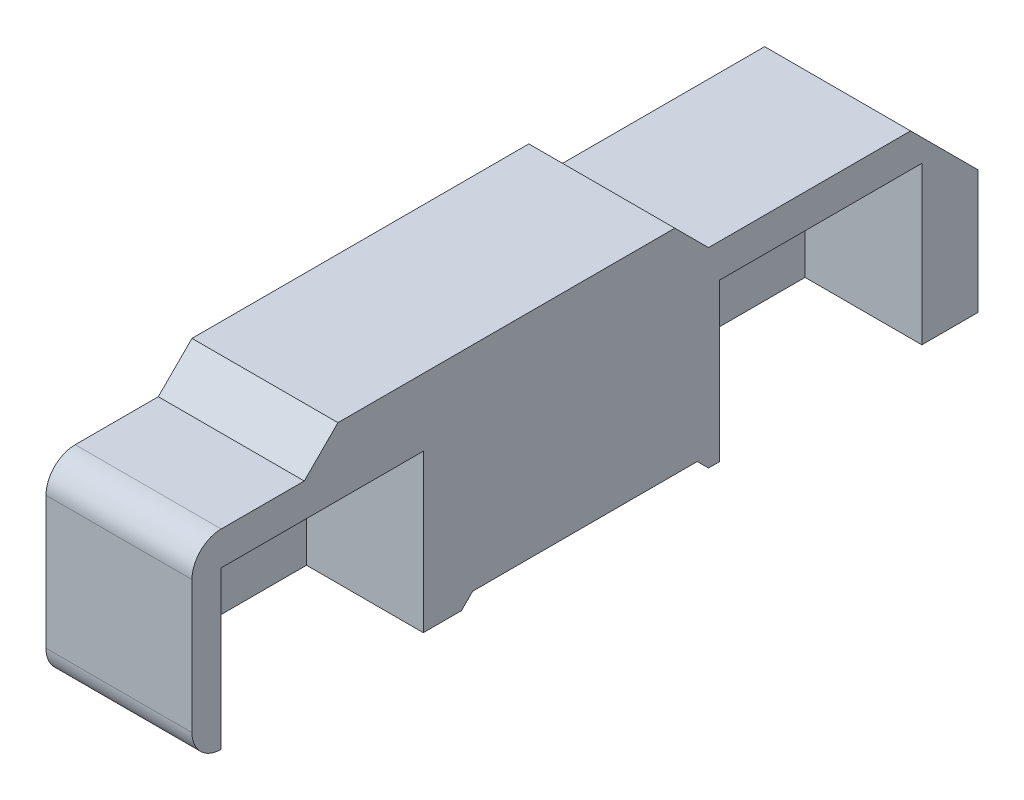
ISO-10303-21;
HEADER;
FILE_DESCRIPTION(('STEP AP214'),'2;1');
FILE_NAME('part.step','',(''),(''),'','','');
FILE_SCHEMA(('AUTOMOTIVE_DESIGN { 1 0 10303 214 1 1 1 1 }'));
ENDSEC;
DATA;
#1=APPLICATION_CONTEXT('core data for automotive mechanical design processes');
#2=APPLICATION_PROTOCOL_DEFINITION('international standard','automotive_design',2000,#1);
#3=PRODUCT_CONTEXT('',#1,'mechanical');
#4=PRODUCT('Part','Part','',(#3));
#5=PRODUCT_RELATED_PRODUCT_CATEGORY('part','',(#4));
#6=PRODUCT_DEFINITION_FORMATION('','',#4);
#7=PRODUCT_DEFINITION_CONTEXT('part definition',#1,'design');
#8=PRODUCT_DEFINITION('design','',#6,#7);
#9=PRODUCT_DEFINITION_SHAPE('','',#8);
#10=(LENGTH_UNIT() NAMED_UNIT(*) SI_UNIT(.MILLI.,.METRE.));
#11=(NAMED_UNIT(*) PLANE_ANGLE_UNIT() SI_UNIT($,.RADIAN.));
#12=(NAMED_UNIT(*) SI_UNIT($,.STERADIAN.) SOLID_ANGLE_UNIT());
#13=UNCERTAINTY_MEASURE_WITH_UNIT(LENGTH_MEASURE(1.E-05),#10,'distance_accuracy_value','');
#14=(GEOMETRIC_REPRESENTATION_CONTEXT(3) GLOBAL_UNCERTAINTY_ASSIGNED_CONTEXT((#13)) GLOBAL_UNIT_ASSIGNED_CONTEXT((#10,
#11,#12)) REPRESENTATION_CONTEXT('',''));
#15=CARTESIAN_POINT('',(0.,0.,0.));
#16=DIRECTION('',(0.,0.,1.));
#17=DIRECTION('',(1.,0.,0.));
#18=AXIS2_PLACEMENT_3D('',#15,#16,#17);
#19=CARTESIAN_POINT('',(65.,0.,0.));
#20=DIRECTION('',(0.,1.,0.));
#21=DIRECTION('',(0.,0.,1.));
#22=AXIS2_PLACEMENT_3D('',#19,#20,#21);
#23=PLANE('',#22);
#24=DIRECTION('',(0.,0.,-1.));
#25=VECTOR('',#24,1.);
#26=CARTESIAN_POINT('',(65.,0.,0.));
#27=LINE('',#26,#25);
#28=CARTESIAN_POINT('',(65.,0.,-103.));
#29=VERTEX_POINT('',#28);
#30=CARTESIAN_POINT('',(65.,0.,-120.));
#31=VERTEX_POINT('',#30);
#32=EDGE_CURVE('E271',#29,#31,#27,.T.);
#33=ORIENTED_EDGE('',*,*,#32,.F.);
#34=DIRECTION('',(1.,0.,0.));
#35=VECTOR('',#34,1.);
#36=CARTESIAN_POINT('',(13.,0.,-103.));
#37=LINE('',#36,#35);
#38=CARTESIAN_POINT('',(13.,0.,-103.));
#39=VERTEX_POINT('',#38);
#40=EDGE_CURVE('E227',#39,#29,#37,.T.);
#41=ORIENTED_EDGE('',*,*,#40,.F.);
#42=DIRECTION('',(0.,0.,-1.));
#43=VECTOR('',#42,1.);
#44=CARTESIAN_POINT('',(13.,0.,-13.));
#45=LINE('',#44,#43);
#46=CARTESIAN_POINT('',(13.,0.,-13.));
#47=VERTEX_POINT('',#46);
#48=EDGE_CURVE('E217',#47,#39,#45,.T.);
#49=ORIENTED_EDGE('',*,*,#48,.F.);
#50=DIRECTION('',(-1.,0.,0.));
#51=VECTOR('',#50,1.);
#52=CARTESIAN_POINT('',(65.,0.,-13.));
#53=LINE('',#52,#51);
#54=CARTESIAN_POINT('',(0.,0.,-13.));
#55=VERTEX_POINT('',#54);
#56=EDGE_CURVE('E210',#47,#55,#53,.T.);
#57=ORIENTED_EDGE('',*,*,#56,.T.);
#58=DIRECTION('',(0.,0.,-1.));
#59=VECTOR('',#58,1.);
#60=CARTESIAN_POINT('',(0.,0.,0.));
#61=LINE('',#60,#59);
#62=CARTESIAN_POINT('',(0.,0.,-120.));
#63=VERTEX_POINT('',#62);
#64=EDGE_CURVE('E341',#55,#63,#61,.T.);
#65=ORIENTED_EDGE('',*,*,#64,.T.);
#66=DIRECTION('',(-1.,0.,0.));
#67=VECTOR('',#66,1.);
#68=CARTESIAN_POINT('',(65.,0.,-120.));
#69=LINE('',#68,#67);
#70=EDGE_CURVE('E236',#31,#63,#69,.T.);
#71=ORIENTED_EDGE('',*,*,#70,.F.);
#72=EDGE_LOOP('',(#33,#41,#49,#57,#65,#71));
#73=FACE_BOUND('',#72,.T.);
#74=ADVANCED_FACE('F43',(#73),#23,.F.);
#75=CARTESIAN_POINT('',(65.,0.,-120.));
#76=DIRECTION('',(0.,0.707106781186546,0.707106781186549));
#77=DIRECTION('',(0.,-0.707106781186549,0.707106781186546));
#78=AXIS2_PLACEMENT_3D('',#75,#76,#77);
#79=PLANE('',#78);
#80=DIRECTION('',(0.,0.707106781186549,-0.707106781186546));
#81=VECTOR('',#80,1.);
#82=CARTESIAN_POINT('',(0.,0.,-120.));
#83=LINE('',#82,#81);
#84=CARTESIAN_POINT('',(0.,5.,-125.));
#85=VERTEX_POINT('',#84);
#86=EDGE_CURVE('E332',#63,#85,#83,.T.);
#87=ORIENTED_EDGE('',*,*,#86,.T.);
#88=DIRECTION('',(-1.,0.,0.));
#89=VECTOR('',#88,1.);
#90=CARTESIAN_POINT('',(65.,5.,-125.));
#91=LINE('',#90,#89);
#92=CARTESIAN_POINT('',(65.,5.,-125.));
#93=VERTEX_POINT('',#92);
#94=EDGE_CURVE('E239',#93,#85,#91,.T.);
#95=ORIENTED_EDGE('',*,*,#94,.F.);
#96=DIRECTION('',(0.,0.707106781186549,-0.707106781186546));
#97=VECTOR('',#96,1.);
#98=CARTESIAN_POINT('',(65.,0.,-120.));
#99=LINE('',#98,#97);
#100=EDGE_CURVE('E276',#31,#93,#99,.T.);
#101=ORIENTED_EDGE('',*,*,#100,.F.);
#102=ORIENTED_EDGE('',*,*,#70,.T.);
#103=EDGE_LOOP('',(#87,#95,#101,#102));
#104=FACE_BOUND('',#103,.T.);
#105=ADVANCED_FACE('F494',(#104),#79,.F.);
#106=CARTESIAN_POINT('',(65.,5.,-125.));
#107=DIRECTION('',(0.,1.,0.));
#108=DIRECTION('',(0.,0.,1.));
#109=AXIS2_PLACEMENT_3D('',#106,#107,#108);
#110=PLANE('',#109);
#111=DIRECTION('',(0.,0.,-1.));
#112=VECTOR('',#111,1.);
#113=CARTESIAN_POINT('',(0.,5.,-125.));
#114=LINE('',#113,#112);
#115=CARTESIAN_POINT('',(0.,5.,-225.));
#116=VERTEX_POINT('',#115);
#117=EDGE_CURVE('E325',#85,#116,#114,.T.);
#118=ORIENTED_EDGE('',*,*,#117,.T.);
#119=DIRECTION('',(-1.,0.,0.));
#120=VECTOR('',#119,1.);
#121=CARTESIAN_POINT('',(65.,5.,-225.));
#122=LINE('',#121,#120);
#123=CARTESIAN_POINT('',(65.,5.,-225.));
#124=VERTEX_POINT('',#123);
#125=EDGE_CURVE('E314',#124,#116,#122,.T.);
#126=ORIENTED_EDGE('',*,*,#125,.F.);
#127=DIRECTION('',(0.,0.,-1.));
#128=VECTOR('',#127,1.);
#129=CARTESIAN_POINT('',(65.,5.,-125.));
#130=LINE('',#129,#128);
#131=EDGE_CURVE('E326',#93,#124,#130,.T.);
#132=ORIENTED_EDGE('',*,*,#131,.F.);
#133=ORIENTED_EDGE('',*,*,#94,.T.);
#134=EDGE_LOOP('',(#118,#126,#132,#133));
#135=FACE_BOUND('',#134,.T.);
#136=ADVANCED_FACE('F323',(#135),#110,.F.);
#137=CARTESIAN_POINT('',(65.,5.,-225.));
#138=DIRECTION('',(0.,0.70710678118655,-0.707106781186545));
#139=DIRECTION('',(0.,0.707106781186545,0.70710678118655));
#140=AXIS2_PLACEMENT_3D('',#137,#138,#139);
#141=PLANE('',#140);
#142=DIRECTION('',(0.,-0.707106781186545,-0.70710678118655));
#143=VECTOR('',#142,1.);
#144=CARTESIAN_POINT('',(0.,5.,-225.));
#145=LINE('',#144,#143);
#146=CARTESIAN_POINT('',(0.,0.,-230.));
#147=VERTEX_POINT('',#146);
#148=EDGE_CURVE('E334',#116,#147,#145,.T.);
#149=ORIENTED_EDGE('',*,*,#148,.T.);
#150=DIRECTION('',(-1.,0.,0.));
#151=VECTOR('',#150,1.);
#152=CARTESIAN_POINT('',(65.,0.,-230.));
#153=LINE('',#152,#151);
#154=CARTESIAN_POINT('',(65.,0.,-230.));
#155=VERTEX_POINT('',#154);
#156=EDGE_CURVE('E310',#155,#147,#153,.T.);
#157=ORIENTED_EDGE('',*,*,#156,.F.);
#158=DIRECTION('',(0.,-0.707106781186545,-0.70710678118655));
#159=VECTOR('',#158,1.);
#160=CARTESIAN_POINT('',(65.,5.,-225.));
#161=LINE('',#160,#159);
#162=EDGE_CURVE('E439',#124,#155,#161,.T.);
#163=ORIENTED_EDGE('',*,*,#162,.F.);
#164=ORIENTED_EDGE('',*,*,#125,.T.);
#165=EDGE_LOOP('',(#149,#157,#163,#164));
#166=FACE_BOUND('',#165,.T.);
#167=ADVANCED_FACE('F491',(#166),#141,.F.);
#168=CARTESIAN_POINT('',(65.,0.,-230.));
#169=DIRECTION('',(0.,1.,0.));
#170=DIRECTION('',(0.,0.,1.));
#171=AXIS2_PLACEMENT_3D('',#168,#169,#170);
#172=PLANE('',#171);
#173=DIRECTION('',(0.,0.,-1.));
#174=VECTOR('',#173,1.);
#175=CARTESIAN_POINT('',(13.,0.,-235.));
#176=LINE('',#175,#174);
#177=CARTESIAN_POINT('',(13.,0.,-235.));
#178=VERTEX_POINT('',#177);
#179=CARTESIAN_POINT('',(13.,0.,-325.));
#180=VERTEX_POINT('',#179);
#181=EDGE_CURVE('E428',#178,#180,#176,.T.);
#182=ORIENTED_EDGE('',*,*,#181,.F.);
#183=DIRECTION('',(1.,0.,0.));
#184=VECTOR('',#183,1.);
#185=CARTESIAN_POINT('',(13.,0.,-235.));
#186=LINE('',#185,#184);
#187=CARTESIAN_POINT('',(65.,0.,-235.));
#188=VERTEX_POINT('',#187);
#189=EDGE_CURVE('E397',#178,#188,#186,.T.);
#190=ORIENTED_EDGE('',*,*,#189,.T.);
#191=DIRECTION('',(0.,0.,-1.));
#192=VECTOR('',#191,1.);
#193=CARTESIAN_POINT('',(65.,0.,-230.));
#194=LINE('',#193,#192);
#195=EDGE_CURVE('E443',#155,#188,#194,.T.);
#196=ORIENTED_EDGE('',*,*,#195,.F.);
#197=ORIENTED_EDGE('',*,*,#156,.T.);
#198=DIRECTION('',(0.,0.,-1.));
#199=VECTOR('',#198,1.);
#200=CARTESIAN_POINT('',(0.,0.,-230.));
#201=LINE('',#200,#199);
#202=CARTESIAN_POINT('',(0.,0.,-350.));
#203=VERTEX_POINT('',#202);
#204=EDGE_CURVE('E339',#147,#203,#201,.T.);
#205=ORIENTED_EDGE('',*,*,#204,.T.);
#206=DIRECTION('',(-1.,0.,0.));
#207=VECTOR('',#206,1.);
#208=CARTESIAN_POINT('',(65.,0.,-350.));
#209=LINE('',#208,#207);
#210=CARTESIAN_POINT('',(65.,0.,-350.));
#211=VERTEX_POINT('',#210);
#212=EDGE_CURVE('E306',#211,#203,#209,.T.);
#213=ORIENTED_EDGE('',*,*,#212,.F.);
#214=CARTESIAN_POINT('',(65.,0.,-325.));
#215=VERTEX_POINT('',#214);
#216=EDGE_CURVE('E442',#215,#211,#194,.T.);
#217=ORIENTED_EDGE('',*,*,#216,.F.);
#218=DIRECTION('',(1.,0.,0.));
#219=VECTOR('',#218,1.);
#220=CARTESIAN_POINT('',(13.,0.,-325.));
#221=LINE('',#220,#219);
#222=EDGE_CURVE('E59',#180,#215,#221,.T.);
#223=ORIENTED_EDGE('',*,*,#222,.F.);
#224=EDGE_LOOP('',(#182,#190,#196,#197,#205,#213,#217,#223));
#225=FACE_BOUND('',#224,.T.);
#226=ADVANCED_FACE('F486',(#225),#172,.F.);
#227=CARTESIAN_POINT('',(65.,55.0000000000002,-350.));
#228=DIRECTION('',(0.,0.,1.));
#229=DIRECTION('',(1.,0.,0.));
#230=AXIS2_PLACEMENT_3D('',#227,#228,#229);
#231=PLANE('',#230);
#232=DIRECTION('',(0.,1.,0.));
#233=VECTOR('',#232,1.);
#234=CARTESIAN_POINT('',(0.,55.0000000000002,-350.));
#235=LINE('',#234,#233);
#236=CARTESIAN_POINT('',(0.,55.0000000000002,-350.));
#237=VERTEX_POINT('',#236);
#238=EDGE_CURVE('E347',#203,#237,#235,.T.);
#239=ORIENTED_EDGE('',*,*,#238,.T.);
#240=DIRECTION('',(-1.,0.,0.));
#241=VECTOR('',#240,1.);
#242=CARTESIAN_POINT('',(65.,55.0000000000002,-350.));
#243=LINE('',#242,#241);
#244=CARTESIAN_POINT('',(65.,55.0000000000002,-350.));
#245=VERTEX_POINT('',#244);
#246=EDGE_CURVE('E302',#245,#237,#243,.T.);
#247=ORIENTED_EDGE('',*,*,#246,.F.);
#248=DIRECTION('',(0.,1.,0.));
#249=VECTOR('',#248,1.);
#250=CARTESIAN_POINT('',(65.,55.0000000000002,-350.));
#251=LINE('',#250,#249);
#252=EDGE_CURVE('E447',#211,#245,#251,.T.);
#253=ORIENTED_EDGE('',*,*,#252,.F.);
#254=ORIENTED_EDGE('',*,*,#212,.T.);
#255=EDGE_LOOP('',(#239,#247,#253,#254));
#256=FACE_BOUND('',#255,.T.);
#257=ADVANCED_FACE('F480',(#256),#231,.F.);
#258=CARTESIAN_POINT('',(65.,85.,-320.));
#259=DIRECTION('',(0.,-0.707106781186548,0.707106781186547));
#260=DIRECTION('',(0.,-0.707106781186547,-0.707106781186548));
#261=AXIS2_PLACEMENT_3D('',#258,#259,#260);
#262=PLANE('',#261);
#263=DIRECTION('',(0.,0.707106781186547,0.707106781186548));
#264=VECTOR('',#263,1.);
#265=CARTESIAN_POINT('',(0.,85.,-320.));
#266=LINE('',#265,#264);
#267=CARTESIAN_POINT('',(0.,85.,-320.));
#268=VERTEX_POINT('',#267);
#269=EDGE_CURVE('E350',#237,#268,#266,.T.);
#270=ORIENTED_EDGE('',*,*,#269,.T.);
#271=DIRECTION('',(-1.,0.,0.));
#272=VECTOR('',#271,1.);
#273=CARTESIAN_POINT('',(65.,85.,-320.));
#274=LINE('',#273,#272);
#275=CARTESIAN_POINT('',(65.,85.,-320.));
#276=VERTEX_POINT('',#275);
#277=EDGE_CURVE('E298',#276,#268,#274,.T.);
#278=ORIENTED_EDGE('',*,*,#277,.F.);
#279=DIRECTION('',(0.,0.707106781186547,0.707106781186548));
#280=VECTOR('',#279,1.);
#281=CARTESIAN_POINT('',(65.,85.,-320.));
#282=LINE('',#281,#280);
#283=EDGE_CURVE('E450',#245,#276,#282,.T.);
#284=ORIENTED_EDGE('',*,*,#283,.F.);
#285=ORIENTED_EDGE('',*,*,#246,.T.);
#286=EDGE_LOOP('',(#270,#278,#284,#285));
#287=FACE_BOUND('',#286,.T.);
#288=ADVANCED_FACE('F476',(#287),#262,.F.);
#289=CARTESIAN_POINT('',(65.,85.,-230.));
#290=DIRECTION('',(0.,-1.,0.));
#291=DIRECTION('',(0.,0.,-1.));
#292=AXIS2_PLACEMENT_3D('',#289,#290,#291);
#293=PLANE('',#292);
#294=DIRECTION('',(0.,0.,1.));
#295=VECTOR('',#294,1.);
#296=CARTESIAN_POINT('',(0.,85.,-230.));
#297=LINE('',#296,#295);
#298=CARTESIAN_POINT('',(0.,85.,-230.));
#299=VERTEX_POINT('',#298);
#300=EDGE_CURVE('E353',#268,#299,#297,.T.);
#301=ORIENTED_EDGE('',*,*,#300,.T.);
#302=DIRECTION('',(-1.,0.,0.));
#303=VECTOR('',#302,1.);
#304=CARTESIAN_POINT('',(65.,85.,-230.));
#305=LINE('',#304,#303);
#306=CARTESIAN_POINT('',(65.,85.,-230.));
#307=VERTEX_POINT('',#306);
#308=EDGE_CURVE('E294',#307,#299,#305,.T.);
#309=ORIENTED_EDGE('',*,*,#308,.F.);
#310=DIRECTION('',(0.,0.,1.));
#311=VECTOR('',#310,1.);
#312=CARTESIAN_POINT('',(65.,85.,-230.));
#313=LINE('',#312,#311);
#314=EDGE_CURVE('E453',#276,#307,#313,.T.);
#315=ORIENTED_EDGE('',*,*,#314,.F.);
#316=ORIENTED_EDGE('',*,*,#277,.T.);
#317=EDGE_LOOP('',(#301,#309,#315,#316));
#318=FACE_BOUND('',#317,.T.);
#319=ADVANCED_FACE('F472',(#318),#293,.F.);
#320=CARTESIAN_POINT('',(65.,100.,-215.));
#321=DIRECTION('',(0.,-0.70710678118655,0.707106781186545));
#322=DIRECTION('',(0.,-0.707106781186545,-0.70710678118655));
#323=AXIS2_PLACEMENT_3D('',#320,#321,#322);
#324=PLANE('',#323);
#325=DIRECTION('',(0.,0.707106781186546,0.70710678118655));
#326=VECTOR('',#325,1.);
#327=CARTESIAN_POINT('',(0.,100.,-215.));
#328=LINE('',#327,#326);
#329=CARTESIAN_POINT('',(0.,100.,-215.));
#330=VERTEX_POINT('',#329);
#331=EDGE_CURVE('E356',#299,#330,#328,.T.);
#332=ORIENTED_EDGE('',*,*,#331,.T.);
#333=DIRECTION('',(-1.,0.,0.));
#334=VECTOR('',#333,1.);
#335=CARTESIAN_POINT('',(65.,100.,-215.));
#336=LINE('',#335,#334);
#337=CARTESIAN_POINT('',(65.,100.,-215.));
#338=VERTEX_POINT('',#337);
#339=EDGE_CURVE('E290',#338,#330,#336,.T.);
#340=ORIENTED_EDGE('',*,*,#339,.F.);
#341=DIRECTION('',(0.,0.707106781186546,0.70710678118655));
#342=VECTOR('',#341,1.);
#343=CARTESIAN_POINT('',(65.,100.,-215.));
#344=LINE('',#343,#342);
#345=EDGE_CURVE('E456',#307,#338,#344,.T.);
#346=ORIENTED_EDGE('',*,*,#345,.F.);
#347=ORIENTED_EDGE('',*,*,#308,.T.);
#348=EDGE_LOOP('',(#332,#340,#346,#347));
#349=FACE_BOUND('',#348,.T.);
#350=ADVANCED_FACE('F468',(#349),#324,.F.);
#351=CARTESIAN_POINT('',(65.,100.,-64.9999999999999));
#352=DIRECTION('',(0.,-1.,0.));
#353=DIRECTION('',(0.,0.,-1.));
#354=AXIS2_PLACEMENT_3D('',#351,#352,#353);
#355=PLANE('',#354);
#356=DIRECTION('',(0.,0.,1.));
#357=VECTOR('',#356,1.);
#358=CARTESIAN_POINT('',(0.,100.,-64.9999999999999));
#359=LINE('',#358,#357);
#360=CARTESIAN_POINT('',(0.,100.,-64.9999999999999));
#361=VERTEX_POINT('',#360);
#362=EDGE_CURVE('E359',#330,#361,#359,.T.);
#363=ORIENTED_EDGE('',*,*,#362,.T.);
#364=DIRECTION('',(-1.,0.,0.));
#365=VECTOR('',#364,1.);
#366=CARTESIAN_POINT('',(65.,100.,-64.9999999999999));
#367=LINE('',#366,#365);
#368=CARTESIAN_POINT('',(65.,100.,-64.9999999999999));
#369=VERTEX_POINT('',#368);
#370=EDGE_CURVE('E286',#369,#361,#367,.T.);
#371=ORIENTED_EDGE('',*,*,#370,.F.);
#372=DIRECTION('',(0.,0.,1.));
#373=VECTOR('',#372,1.);
#374=CARTESIAN_POINT('',(65.,100.,-64.9999999999999));
#375=LINE('',#374,#373);
#376=EDGE_CURVE('E380',#338,#369,#375,.T.);
#377=ORIENTED_EDGE('',*,*,#376,.F.);
#378=ORIENTED_EDGE('',*,*,#339,.T.);
#379=EDGE_LOOP('',(#363,#371,#377,#378));
#380=FACE_BOUND('',#379,.T.);
#381=ADVANCED_FACE('F463',(#380),#355,.F.);
#382=CARTESIAN_POINT('',(65.,85.,-50.));
#383=DIRECTION('',(0.,-0.707106781186546,-0.707106781186549));
#384=DIRECTION('',(0.,0.707106781186549,-0.707106781186546));
#385=AXIS2_PLACEMENT_3D('',#382,#383,#384);
#386=PLANE('',#385);
#387=DIRECTION('',(0.,-0.707106781186549,0.707106781186546));
#388=VECTOR('',#387,1.);
#389=CARTESIAN_POINT('',(0.,85.,-50.));
#390=LINE('',#389,#388);
#391=CARTESIAN_POINT('',(0.,85.,-50.));
#392=VERTEX_POINT('',#391);
#393=EDGE_CURVE('E278',#361,#392,#390,.T.);
#394=ORIENTED_EDGE('',*,*,#393,.T.);
#395=DIRECTION('',(-1.,0.,0.));
#396=VECTOR('',#395,1.);
#397=CARTESIAN_POINT('',(65.,85.,-50.));
#398=LINE('',#397,#396);
#399=CARTESIAN_POINT('',(65.,85.,-50.));
#400=VERTEX_POINT('',#399);
#401=EDGE_CURVE('E282',#400,#392,#398,.T.);
#402=ORIENTED_EDGE('',*,*,#401,.F.);
#403=DIRECTION('',(0.,-0.707106781186549,0.707106781186546));
#404=VECTOR('',#403,1.);
#405=CARTESIAN_POINT('',(65.,85.,-50.));
#406=LINE('',#405,#404);
#407=EDGE_CURVE('E374',#369,#400,#406,.T.);
#408=ORIENTED_EDGE('',*,*,#407,.F.);
#409=ORIENTED_EDGE('',*,*,#370,.T.);
#410=EDGE_LOOP('',(#394,#402,#408,#409));
#411=FACE_BOUND('',#410,.T.);
#412=ADVANCED_FACE('F365',(#411),#386,.F.);
#413=CARTESIAN_POINT('',(65.,85.,0.));
#414=DIRECTION('',(0.,-1.,0.));
#415=DIRECTION('',(0.,0.,-1.));
#416=AXIS2_PLACEMENT_3D('',#413,#414,#415);
#417=PLANE('',#416);
#418=DIRECTION('',(0.,0.,1.));
#419=VECTOR('',#418,1.);
#420=CARTESIAN_POINT('',(0.,85.,0.));
#421=LINE('',#420,#419);
#422=CARTESIAN_POINT('',(0.,85.,-13.));
#423=VERTEX_POINT('',#422);
#424=EDGE_CURVE('E272',#392,#423,#421,.T.);
#425=ORIENTED_EDGE('',*,*,#424,.T.);
#426=DIRECTION('',(-1.,0.,0.));
#427=VECTOR('',#426,1.);
#428=CARTESIAN_POINT('',(65.,85.,-13.));
#429=LINE('',#428,#427);
#430=CARTESIAN_POINT('',(65.,85.,-13.));
#431=VERTEX_POINT('',#430);
#432=EDGE_CURVE('E11',#423,#431,#429,.F.);
#433=ORIENTED_EDGE('',*,*,#432,.T.);
#434=DIRECTION('',(0.,0.,1.));
#435=VECTOR('',#434,1.);
#436=CARTESIAN_POINT('',(65.,85.,0.));
#437=LINE('',#436,#435);
#438=EDGE_CURVE('E371',#400,#431,#437,.T.);
#439=ORIENTED_EDGE('',*,*,#438,.F.);
#440=ORIENTED_EDGE('',*,*,#401,.T.);
#441=EDGE_LOOP('',(#425,#433,#439,#440));
#442=FACE_BOUND('',#441,.T.);
#443=ADVANCED_FACE('F370',(#442),#417,.F.);
#444=CARTESIAN_POINT('',(65.,0.,0.));
#445=DIRECTION('',(0.,0.,-1.));
#446=DIRECTION('',(-1.,0.,0.));
#447=AXIS2_PLACEMENT_3D('',#444,#445,#446);
#448=PLANE('',#447);
#449=DIRECTION('',(0.,-1.,0.));
#450=VECTOR('',#449,1.);
#451=CARTESIAN_POINT('',(0.,0.,0.));
#452=LINE('',#451,#450);
#453=CARTESIAN_POINT('',(0.,72.,0.));
#454=VERTEX_POINT('',#453);
#455=CARTESIAN_POINT('',(0.,13.,0.));
#456=VERTEX_POINT('',#455);
#457=EDGE_CURVE('E268',#454,#456,#452,.T.);
#458=ORIENTED_EDGE('',*,*,#457,.T.);
#459=DIRECTION('',(-1.,0.,0.));
#460=VECTOR('',#459,1.);
#461=CARTESIAN_POINT('',(65.,13.,0.));
#462=LINE('',#461,#460);
#463=CARTESIAN_POINT('',(65.,13.,0.));
#464=VERTEX_POINT('',#463);
#465=EDGE_CURVE('E251',#456,#464,#462,.F.);
#466=ORIENTED_EDGE('',*,*,#465,.T.);
#467=DIRECTION('',(0.,-1.,0.));
#468=VECTOR('',#467,1.);
#469=CARTESIAN_POINT('',(65.,0.,0.));
#470=LINE('',#469,#468);
#471=CARTESIAN_POINT('',(65.,72.,0.));
#472=VERTEX_POINT('',#471);
#473=EDGE_CURVE('E262',#472,#464,#470,.T.);
#474=ORIENTED_EDGE('',*,*,#473,.F.);
#475=DIRECTION('',(-1.,0.,0.));
#476=VECTOR('',#475,1.);
#477=CARTESIAN_POINT('',(65.,72.,0.));
#478=LINE('',#477,#476);
#479=EDGE_CURVE('E247',#472,#454,#478,.T.);
#480=ORIENTED_EDGE('',*,*,#479,.T.);
#481=EDGE_LOOP('',(#458,#466,#474,#480));
#482=FACE_BOUND('',#481,.T.);
#483=ADVANCED_FACE('F265',(#482),#448,.F.);
#484=CARTESIAN_POINT('',(65.,0.,0.));
#485=DIRECTION('',(-1.,0.,0.));
#486=DIRECTION('',(0.,0.,1.));
#487=AXIS2_PLACEMENT_3D('',#484,#485,#486);
#488=PLANE('',#487);
#489=CARTESIAN_POINT('',(65.,13.,-13.));
#490=DIRECTION('',(-1.,0.,0.));
#491=DIRECTION('',(0.,0.,1.));
#492=AXIS2_PLACEMENT_3D('',#489,#490,#491);
#493=CIRCLE('',#492,13.);
#494=CARTESIAN_POINT('',(65.,0.,-13.));
#495=VERTEX_POINT('',#494);
#496=EDGE_CURVE('E52',#464,#495,#493,.F.);
#497=ORIENTED_EDGE('',*,*,#496,.T.);
#498=DIRECTION('',(0.,-1.,0.));
#499=VECTOR('',#498,1.);
#500=CARTESIAN_POINT('',(65.,0.,-13.));
#501=LINE('',#500,#499);
#502=CARTESIAN_POINT('',(65.,70.,-13.));
#503=VERTEX_POINT('',#502);
#504=EDGE_CURVE('E203',#503,#495,#501,.T.);
#505=ORIENTED_EDGE('',*,*,#504,.F.);
#506=DIRECTION('',(0.,0.,1.));
#507=VECTOR('',#506,1.);
#508=CARTESIAN_POINT('',(65.,70.,-13.));
#509=LINE('',#508,#507);
#510=CARTESIAN_POINT('',(65.,70.,-103.));
#511=VERTEX_POINT('',#510);
#512=EDGE_CURVE('E222',#511,#503,#509,.T.);
#513=ORIENTED_EDGE('',*,*,#512,.F.);
#514=DIRECTION('',(0.,1.,0.));
#515=VECTOR('',#514,1.);
#516=CARTESIAN_POINT('',(65.,0.,-103.));
#517=LINE('',#516,#515);
#518=EDGE_CURVE('E759',#29,#511,#517,.T.);
#519=ORIENTED_EDGE('',*,*,#518,.F.);
#520=ORIENTED_EDGE('',*,*,#32,.T.);
#521=ORIENTED_EDGE('',*,*,#100,.T.);
#522=ORIENTED_EDGE('',*,*,#131,.T.);
#523=ORIENTED_EDGE('',*,*,#162,.T.);
#524=ORIENTED_EDGE('',*,*,#195,.T.);
#525=DIRECTION('',(0.,-1.,0.));
#526=VECTOR('',#525,1.);
#527=CARTESIAN_POINT('',(65.,70.,-235.));
#528=LINE('',#527,#526);
#529=CARTESIAN_POINT('',(65.,70.,-235.));
#530=VERTEX_POINT('',#529);
#531=EDGE_CURVE('E418',#530,#188,#528,.T.);
#532=ORIENTED_EDGE('',*,*,#531,.F.);
#533=DIRECTION('',(0.,0.,1.));
#534=VECTOR('',#533,1.);
#535=CARTESIAN_POINT('',(65.,70.,-235.));
#536=LINE('',#535,#534);
#537=CARTESIAN_POINT('',(65.,70.,-325.));
#538=VERTEX_POINT('',#537);
#539=EDGE_CURVE('E410',#538,#530,#536,.T.);
#540=ORIENTED_EDGE('',*,*,#539,.F.);
#541=DIRECTION('',(0.,1.,0.));
#542=VECTOR('',#541,1.);
#543=CARTESIAN_POINT('',(65.,70.,-325.));
#544=LINE('',#543,#542);
#545=EDGE_CURVE('E414',#215,#538,#544,.T.);
#546=ORIENTED_EDGE('',*,*,#545,.F.);
#547=ORIENTED_EDGE('',*,*,#216,.T.);
#548=ORIENTED_EDGE('',*,*,#252,.T.);
#549=ORIENTED_EDGE('',*,*,#283,.T.);
#550=ORIENTED_EDGE('',*,*,#314,.T.);
#551=ORIENTED_EDGE('',*,*,#345,.T.);
#552=ORIENTED_EDGE('',*,*,#376,.T.);
#553=ORIENTED_EDGE('',*,*,#407,.T.);
#554=ORIENTED_EDGE('',*,*,#438,.T.);
#555=CARTESIAN_POINT('',(65.,72.,-13.));
#556=DIRECTION('',(-1.,0.,0.));
#557=DIRECTION('',(0.,0.,1.));
#558=AXIS2_PLACEMENT_3D('',#555,#556,#557);
#559=CIRCLE('',#558,13.);
#560=EDGE_CURVE('E254',#431,#472,#559,.F.);
#561=ORIENTED_EDGE('',*,*,#560,.T.);
#562=ORIENTED_EDGE('',*,*,#473,.T.);
#563=EDGE_LOOP('',(#497,#505,#513,#519,#520,#521,#522,#523,#524,#532,#540,#546,#547,#548,#549,
#550,#551,#552,#553,#554,#561,#562));
#564=FACE_BOUND('',#563,.T.);
#565=ADVANCED_FACE('F259',(#564),#488,.F.);
#566=CARTESIAN_POINT('',(0.,0.,0.));
#567=DIRECTION('',(-1.,0.,0.));
#568=DIRECTION('',(0.,0.,1.));
#569=AXIS2_PLACEMENT_3D('',#566,#567,#568);
#570=PLANE('',#569);
#571=ORIENTED_EDGE('',*,*,#64,.F.);
#572=CARTESIAN_POINT('',(0.,13.,-13.));
#573=DIRECTION('',(-1.,0.,0.));
#574=DIRECTION('',(0.,0.,1.));
#575=AXIS2_PLACEMENT_3D('',#572,#573,#574);
#576=CIRCLE('',#575,13.);
#577=EDGE_CURVE('E233',#55,#456,#576,.T.);
#578=ORIENTED_EDGE('',*,*,#577,.T.);
#579=ORIENTED_EDGE('',*,*,#457,.F.);
#580=CARTESIAN_POINT('',(0.,72.,-13.));
#581=DIRECTION('',(-1.,0.,0.));
#582=DIRECTION('',(0.,0.,1.));
#583=AXIS2_PLACEMENT_3D('',#580,#581,#582);
#584=CIRCLE('',#583,13.);
#585=EDGE_CURVE('E209',#454,#423,#584,.T.);
#586=ORIENTED_EDGE('',*,*,#585,.T.);
#587=ORIENTED_EDGE('',*,*,#424,.F.);
#588=ORIENTED_EDGE('',*,*,#393,.F.);
#589=ORIENTED_EDGE('',*,*,#362,.F.);
#590=ORIENTED_EDGE('',*,*,#331,.F.);
#591=ORIENTED_EDGE('',*,*,#300,.F.);
#592=ORIENTED_EDGE('',*,*,#269,.F.);
#593=ORIENTED_EDGE('',*,*,#238,.F.);
#594=ORIENTED_EDGE('',*,*,#204,.F.);
#595=ORIENTED_EDGE('',*,*,#148,.F.);
#596=ORIENTED_EDGE('',*,*,#117,.F.);
#597=ORIENTED_EDGE('',*,*,#86,.F.);
#598=EDGE_LOOP('',(#571,#578,#579,#586,#587,#588,#589,#590,#591,#592,#593,#594,#595,#596,#597));
#599=FACE_BOUND('',#598,.T.);
#600=ADVANCED_FACE('F331',(#599),#570,.T.);
#601=CARTESIAN_POINT('',(65.,13.,-13.));
#602=DIRECTION('',(-1.,0.,0.));
#603=DIRECTION('',(0.,0.,1.));
#604=AXIS2_PLACEMENT_3D('',#601,#602,#603);
#605=CYLINDRICAL_SURFACE('',#604,13.);
#606=ORIENTED_EDGE('',*,*,#496,.F.);
#607=ORIENTED_EDGE('',*,*,#465,.F.);
#608=ORIENTED_EDGE('',*,*,#577,.F.);
#609=ORIENTED_EDGE('',*,*,#56,.F.);
#610=EDGE_CURVE('E197',#495,#47,#53,.T.);
#611=ORIENTED_EDGE('',*,*,#610,.F.);
#612=EDGE_LOOP('',(#606,#607,#608,#609,#611));
#613=FACE_BOUND('',#612,.T.);
#614=ADVANCED_FACE('F231',(#613),#605,.T.);
#615=CARTESIAN_POINT('',(65.,72.,-13.));
#616=DIRECTION('',(-1.,0.,0.));
#617=DIRECTION('',(0.,0.,1.));
#618=AXIS2_PLACEMENT_3D('',#615,#616,#617);
#619=CYLINDRICAL_SURFACE('',#618,13.);
#620=ORIENTED_EDGE('',*,*,#560,.F.);
#621=ORIENTED_EDGE('',*,*,#432,.F.);
#622=ORIENTED_EDGE('',*,*,#585,.F.);
#623=ORIENTED_EDGE('',*,*,#479,.F.);
#624=EDGE_LOOP('',(#620,#621,#622,#623));
#625=FACE_BOUND('',#624,.T.);
#626=ADVANCED_FACE('F45',(#625),#619,.T.);
#627=CARTESIAN_POINT('',(13.,0.,-13.));
#628=DIRECTION('',(0.,0.,1.));
#629=DIRECTION('',(1.,0.,0.));
#630=AXIS2_PLACEMENT_3D('',#627,#628,#629);
#631=PLANE('',#630);
#632=ORIENTED_EDGE('',*,*,#504,.T.);
#633=ORIENTED_EDGE('',*,*,#610,.T.);
#634=DIRECTION('',(0.,-1.,0.));
#635=VECTOR('',#634,1.);
#636=CARTESIAN_POINT('',(13.,0.,-13.));
#637=LINE('',#636,#635);
#638=CARTESIAN_POINT('',(13.,70.,-13.));
#639=VERTEX_POINT('',#638);
#640=EDGE_CURVE('E200',#639,#47,#637,.T.);
#641=ORIENTED_EDGE('',*,*,#640,.F.);
#642=DIRECTION('',(1.,0.,0.));
#643=VECTOR('',#642,1.);
#644=CARTESIAN_POINT('',(13.,70.,-13.));
#645=LINE('',#644,#643);
#646=EDGE_CURVE('E384',#639,#503,#645,.T.);
#647=ORIENTED_EDGE('',*,*,#646,.T.);
#648=EDGE_LOOP('',(#632,#633,#641,#647));
#649=FACE_BOUND('',#648,.T.);
#650=ADVANCED_FACE('F199',(#649),#631,.F.);
#651=CARTESIAN_POINT('',(13.,70.,-13.));
#652=DIRECTION('',(0.,1.,0.));
#653=DIRECTION('',(0.,0.,1.));
#654=AXIS2_PLACEMENT_3D('',#651,#652,#653);
#655=PLANE('',#654);
#656=ORIENTED_EDGE('',*,*,#512,.T.);
#657=ORIENTED_EDGE('',*,*,#646,.F.);
#658=DIRECTION('',(0.,0.,1.));
#659=VECTOR('',#658,1.);
#660=CARTESIAN_POINT('',(13.,70.,-13.));
#661=LINE('',#660,#659);
#662=CARTESIAN_POINT('',(13.,70.,-103.));
#663=VERTEX_POINT('',#662);
#664=EDGE_CURVE('E220',#663,#639,#661,.T.);
#665=ORIENTED_EDGE('',*,*,#664,.F.);
#666=DIRECTION('',(1.,0.,0.));
#667=VECTOR('',#666,1.);
#668=CARTESIAN_POINT('',(13.,70.,-103.));
#669=LINE('',#668,#667);
#670=EDGE_CURVE('E387',#663,#511,#669,.T.);
#671=ORIENTED_EDGE('',*,*,#670,.T.);
#672=EDGE_LOOP('',(#656,#657,#665,#671));
#673=FACE_BOUND('',#672,.T.);
#674=ADVANCED_FACE('F596',(#673),#655,.F.);
#675=CARTESIAN_POINT('',(13.,0.,-103.));
#676=DIRECTION('',(0.,0.,-1.));
#677=DIRECTION('',(-1.,0.,0.));
#678=AXIS2_PLACEMENT_3D('',#675,#676,#677);
#679=PLANE('',#678);
#680=ORIENTED_EDGE('',*,*,#518,.T.);
#681=ORIENTED_EDGE('',*,*,#670,.F.);
#682=DIRECTION('',(0.,1.,0.));
#683=VECTOR('',#682,1.);
#684=CARTESIAN_POINT('',(13.,0.,-103.));
#685=LINE('',#684,#683);
#686=EDGE_CURVE('E229',#39,#663,#685,.T.);
#687=ORIENTED_EDGE('',*,*,#686,.F.);
#688=ORIENTED_EDGE('',*,*,#40,.T.);
#689=EDGE_LOOP('',(#680,#681,#687,#688));
#690=FACE_BOUND('',#689,.T.);
#691=ADVANCED_FACE('F606',(#690),#679,.F.);
#692=CARTESIAN_POINT('',(13.,0.,0.));
#693=DIRECTION('',(-1.,0.,0.));
#694=DIRECTION('',(0.,0.,1.));
#695=AXIS2_PLACEMENT_3D('',#692,#693,#694);
#696=PLANE('',#695);
#697=ORIENTED_EDGE('',*,*,#640,.T.);
#698=ORIENTED_EDGE('',*,*,#48,.T.);
#699=ORIENTED_EDGE('',*,*,#686,.T.);
#700=ORIENTED_EDGE('',*,*,#664,.T.);
#701=EDGE_LOOP('',(#697,#698,#699,#700));
#702=FACE_BOUND('',#701,.T.);
#703=ADVANCED_FACE('F215',(#702),#696,.F.);
#704=CARTESIAN_POINT('',(13.,70.,-235.));
#705=DIRECTION('',(0.,0.,1.));
#706=DIRECTION('',(1.,0.,0.));
#707=AXIS2_PLACEMENT_3D('',#704,#705,#706);
#708=PLANE('',#707);
#709=ORIENTED_EDGE('',*,*,#531,.T.);
#710=ORIENTED_EDGE('',*,*,#189,.F.);
#711=DIRECTION('',(0.,-1.,0.));
#712=VECTOR('',#711,1.);
#713=CARTESIAN_POINT('',(13.,70.,-235.));
#714=LINE('',#713,#712);
#715=CARTESIAN_POINT('',(13.,70.,-235.));
#716=VERTEX_POINT('',#715);
#717=EDGE_CURVE('E415',#716,#178,#714,.T.);
#718=ORIENTED_EDGE('',*,*,#717,.F.);
#719=DIRECTION('',(1.,0.,0.));
#720=VECTOR('',#719,1.);
#721=CARTESIAN_POINT('',(13.,70.,-235.));
#722=LINE('',#721,#720);
#723=EDGE_CURVE('E407',#716,#530,#722,.T.);
#724=ORIENTED_EDGE('',*,*,#723,.T.);
#725=EDGE_LOOP('',(#709,#710,#718,#724));
#726=FACE_BOUND('',#725,.T.);
#727=ADVANCED_FACE('F627',(#726),#708,.F.);
#728=CARTESIAN_POINT('',(13.,70.,-235.));
#729=DIRECTION('',(0.,1.,0.));
#730=DIRECTION('',(0.,0.,1.));
#731=AXIS2_PLACEMENT_3D('',#728,#729,#730);
#732=PLANE('',#731);
#733=ORIENTED_EDGE('',*,*,#539,.T.);
#734=ORIENTED_EDGE('',*,*,#723,.F.);
#735=DIRECTION('',(0.,0.,1.));
#736=VECTOR('',#735,1.);
#737=CARTESIAN_POINT('',(13.,70.,-235.));
#738=LINE('',#737,#736);
#739=CARTESIAN_POINT('',(13.,70.,-325.));
#740=VERTEX_POINT('',#739);
#741=EDGE_CURVE('E401',#740,#716,#738,.T.);
#742=ORIENTED_EDGE('',*,*,#741,.F.);
#743=DIRECTION('',(1.,0.,0.));
#744=VECTOR('',#743,1.);
#745=CARTESIAN_POINT('',(13.,70.,-325.));
#746=LINE('',#745,#744);
#747=EDGE_CURVE('E404',#740,#538,#746,.T.);
#748=ORIENTED_EDGE('',*,*,#747,.T.);
#749=EDGE_LOOP('',(#733,#734,#742,#748));
#750=FACE_BOUND('',#749,.T.);
#751=ADVANCED_FACE('F637',(#750),#732,.F.);
#752=CARTESIAN_POINT('',(13.,70.,-325.));
#753=DIRECTION('',(0.,0.,-1.));
#754=DIRECTION('',(0.,1.,0.));
#755=AXIS2_PLACEMENT_3D('',#752,#753,#754);
#756=PLANE('',#755);
#757=ORIENTED_EDGE('',*,*,#545,.T.);
#758=ORIENTED_EDGE('',*,*,#747,.F.);
#759=DIRECTION('',(0.,1.,0.));
#760=VECTOR('',#759,1.);
#761=CARTESIAN_POINT('',(13.,70.,-325.));
#762=LINE('',#761,#760);
#763=EDGE_CURVE('E424',#180,#740,#762,.T.);
#764=ORIENTED_EDGE('',*,*,#763,.F.);
#765=ORIENTED_EDGE('',*,*,#222,.T.);
#766=EDGE_LOOP('',(#757,#758,#764,#765));
#767=FACE_BOUND('',#766,.T.);
#768=ADVANCED_FACE('F648',(#767),#756,.F.);
#769=CARTESIAN_POINT('',(13.,0.,0.));
#770=DIRECTION('',(1.,0.,0.));
#771=DIRECTION('',(0.,0.,-1.));
#772=AXIS2_PLACEMENT_3D('',#769,#770,#771);
#773=PLANE('',#772);
#774=ORIENTED_EDGE('',*,*,#717,.T.);
#775=ORIENTED_EDGE('',*,*,#181,.T.);
#776=ORIENTED_EDGE('',*,*,#763,.T.);
#777=ORIENTED_EDGE('',*,*,#741,.T.);
#778=EDGE_LOOP('',(#774,#775,#776,#777));
#779=FACE_BOUND('',#778,.T.);
#780=ADVANCED_FACE('F659',(#779),#773,.T.);
#781=CLOSED_SHELL('',(#74,#105,#136,#167,#226,#257,#288,#319,#350,#381,#412,#443,#483,#565,#600,
#614,#626,#650,#674,#691,#703,#727,#751,#768,#780));
#782=MANIFOLD_SOLID_BREP('B2',#781);
#783=ADVANCED_BREP_SHAPE_REPRESENTATION('',(#18,#782),#14);
#784=SHAPE_DEFINITION_REPRESENTATION(#9,#783);
ENDSEC;
END-ISO-10303-21;
